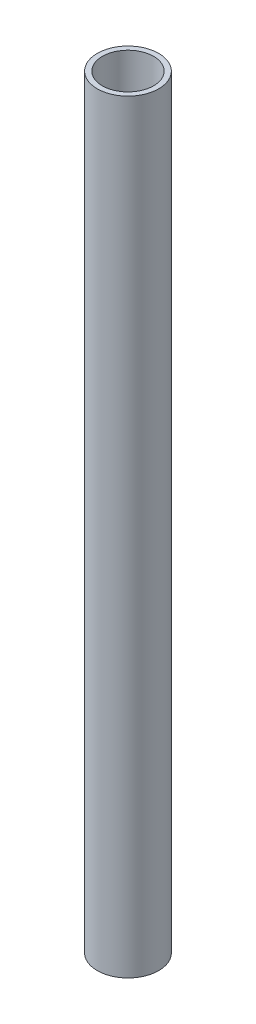
ISO-10303-21;
HEADER;
FILE_DESCRIPTION(('STEP AP214'),'2;1');
FILE_NAME('part.step','',(''),(''),'','','');
FILE_SCHEMA(('AUTOMOTIVE_DESIGN { 1 0 10303 214 1 1 1 1 }'));
ENDSEC;
DATA;
#1=APPLICATION_CONTEXT('core data for automotive mechanical design processes');
#2=APPLICATION_PROTOCOL_DEFINITION('international standard','automotive_design',2000,#1);
#3=PRODUCT_CONTEXT('',#1,'mechanical');
#4=PRODUCT('Part','Part','',(#3));
#5=PRODUCT_RELATED_PRODUCT_CATEGORY('part','',(#4));
#6=PRODUCT_DEFINITION_FORMATION('','',#4);
#7=PRODUCT_DEFINITION_CONTEXT('part definition',#1,'design');
#8=PRODUCT_DEFINITION('design','',#6,#7);
#9=PRODUCT_DEFINITION_SHAPE('','',#8);
#10=(LENGTH_UNIT() NAMED_UNIT(*) SI_UNIT(.MILLI.,.METRE.));
#11=(NAMED_UNIT(*) PLANE_ANGLE_UNIT() SI_UNIT($,.RADIAN.));
#12=(NAMED_UNIT(*) SI_UNIT($,.STERADIAN.) SOLID_ANGLE_UNIT());
#13=UNCERTAINTY_MEASURE_WITH_UNIT(LENGTH_MEASURE(1.E-05),#10,'distance_accuracy_value','');
#14=(GEOMETRIC_REPRESENTATION_CONTEXT(3) GLOBAL_UNCERTAINTY_ASSIGNED_CONTEXT((#13)) GLOBAL_UNIT_ASSIGNED_CONTEXT((#10,
#11,#12)) REPRESENTATION_CONTEXT('',''));
#15=CARTESIAN_POINT('',(0.,0.,0.));
#16=DIRECTION('',(0.,0.,1.));
#17=DIRECTION('',(1.,0.,0.));
#18=AXIS2_PLACEMENT_3D('',#15,#16,#17);
#19=CARTESIAN_POINT('',(0.,373.,0.));
#20=DIRECTION('',(0.,1.,0.));
#21=DIRECTION('',(0.,0.,1.));
#22=AXIS2_PLACEMENT_3D('',#19,#20,#21);
#23=PLANE('',#22);
#24=CARTESIAN_POINT('',(0.,373.,0.));
#25=DIRECTION('',(0.,1.,0.));
#26=DIRECTION('',(0.,0.,1.));
#27=AXIS2_PLACEMENT_3D('',#24,#25,#26);
#28=CIRCLE('',#27,15.);
#29=CARTESIAN_POINT('',(0.,373.,15.));
#30=VERTEX_POINT('',#29);
#31=EDGE_CURVE('E10',#30,#30,#28,.T.);
#32=ORIENTED_EDGE('',*,*,#31,.T.);
#33=EDGE_LOOP('',(#32));
#34=FACE_BOUND('',#33,.T.);
#35=CARTESIAN_POINT('',(0.,373.,0.));
#36=DIRECTION('',(0.,1.,0.));
#37=DIRECTION('',(0.,0.,1.));
#38=AXIS2_PLACEMENT_3D('',#35,#36,#37);
#39=CIRCLE('',#38,12.5);
#40=CARTESIAN_POINT('',(0.,373.,12.5));
#41=VERTEX_POINT('',#40);
#42=EDGE_CURVE('E40',#41,#41,#39,.T.);
#43=ORIENTED_EDGE('',*,*,#42,.F.);
#44=EDGE_LOOP('',(#43));
#45=FACE_BOUND('',#44,.T.);
#46=ADVANCED_FACE('F29',(#34,#45),#23,.T.);
#47=CARTESIAN_POINT('',(0.,0.,0.));
#48=DIRECTION('',(0.,1.,0.));
#49=DIRECTION('',(0.,0.,1.));
#50=AXIS2_PLACEMENT_3D('',#47,#48,#49);
#51=PLANE('',#50);
#52=CARTESIAN_POINT('',(0.,0.,0.));
#53=DIRECTION('',(0.,1.,0.));
#54=DIRECTION('',(0.,0.,1.));
#55=AXIS2_PLACEMENT_3D('',#52,#53,#54);
#56=CIRCLE('',#55,15.);
#57=CARTESIAN_POINT('',(0.,0.,15.));
#58=VERTEX_POINT('',#57);
#59=EDGE_CURVE('E33',#58,#58,#56,.T.);
#60=ORIENTED_EDGE('',*,*,#59,.F.);
#61=EDGE_LOOP('',(#60));
#62=FACE_BOUND('',#61,.T.);
#63=CARTESIAN_POINT('',(0.,0.,0.));
#64=DIRECTION('',(0.,1.,0.));
#65=DIRECTION('',(0.,0.,1.));
#66=AXIS2_PLACEMENT_3D('',#63,#64,#65);
#67=CIRCLE('',#66,12.5);
#68=CARTESIAN_POINT('',(0.,0.,12.5));
#69=VERTEX_POINT('',#68);
#70=EDGE_CURVE('E42',#69,#69,#67,.T.);
#71=ORIENTED_EDGE('',*,*,#70,.T.);
#72=EDGE_LOOP('',(#71));
#73=FACE_BOUND('',#72,.T.);
#74=ADVANCED_FACE('F52',(#62,#73),#51,.F.);
#75=CARTESIAN_POINT('',(0.,373.,0.));
#76=DIRECTION('',(0.,-1.,0.));
#77=DIRECTION('',(0.,0.,-1.));
#78=AXIS2_PLACEMENT_3D('',#75,#76,#77);
#79=CYLINDRICAL_SURFACE('',#78,15.);
#80=ORIENTED_EDGE('',*,*,#31,.F.);
#81=EDGE_LOOP('',(#80));
#82=FACE_BOUND('',#81,.T.);
#83=ORIENTED_EDGE('',*,*,#59,.T.);
#84=EDGE_LOOP('',(#83));
#85=FACE_BOUND('',#84,.T.);
#86=ADVANCED_FACE('F31',(#82,#85),#79,.T.);
#87=CARTESIAN_POINT('',(0.,373.,0.));
#88=DIRECTION('',(0.,-1.,0.));
#89=DIRECTION('',(0.,0.,-1.));
#90=AXIS2_PLACEMENT_3D('',#87,#88,#89);
#91=CYLINDRICAL_SURFACE('',#90,12.5);
#92=ORIENTED_EDGE('',*,*,#42,.T.);
#93=EDGE_LOOP('',(#92));
#94=FACE_BOUND('',#93,.T.);
#95=ORIENTED_EDGE('',*,*,#70,.F.);
#96=EDGE_LOOP('',(#95));
#97=FACE_BOUND('',#96,.T.);
#98=ADVANCED_FACE('F48',(#94,#97),#91,.F.);
#99=CLOSED_SHELL('',(#46,#74,#86,#98));
#100=MANIFOLD_SOLID_BREP('B2',#99);
#101=ADVANCED_BREP_SHAPE_REPRESENTATION('',(#18,#100),#14);
#102=SHAPE_DEFINITION_REPRESENTATION(#9,#101);
ENDSEC;
END-ISO-10303-21;
